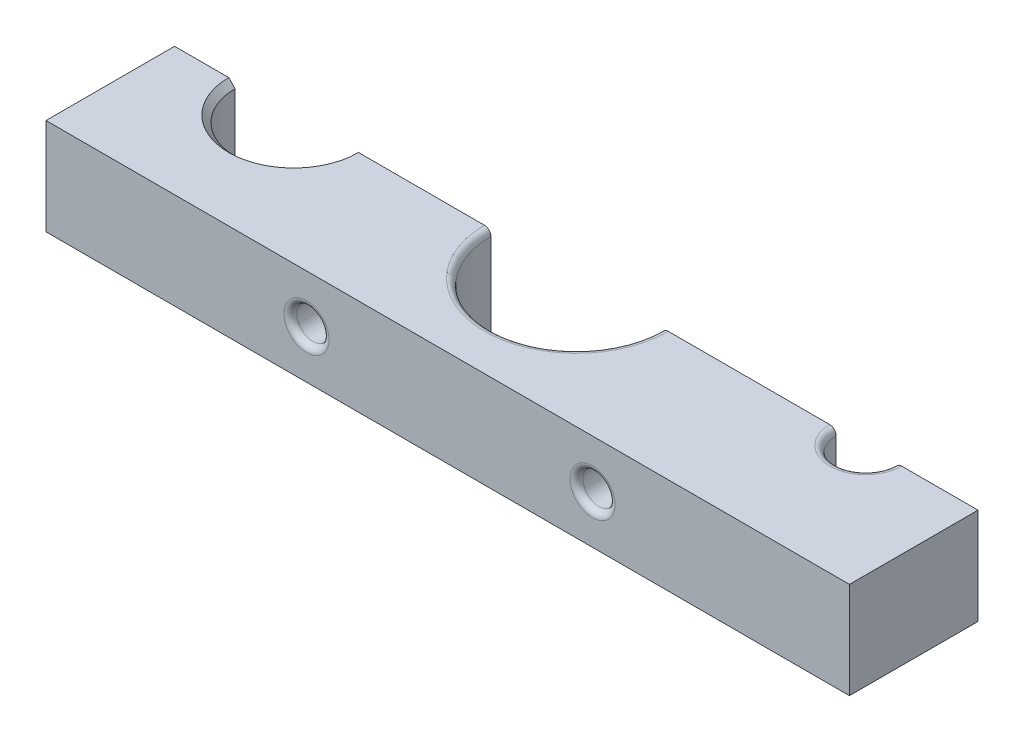
ISO-10303-21;
HEADER;
FILE_DESCRIPTION(('STEP AP214'),'2;1');
FILE_NAME('part.step','',(''),(''),'','','');
FILE_SCHEMA(('AUTOMOTIVE_DESIGN { 1 0 10303 214 1 1 1 1 }'));
ENDSEC;
DATA;
#1=APPLICATION_CONTEXT('core data for automotive mechanical design processes');
#2=APPLICATION_PROTOCOL_DEFINITION('international standard','automotive_design',2000,#1);
#3=PRODUCT_CONTEXT('',#1,'mechanical');
#4=PRODUCT('Part','Part','',(#3));
#5=PRODUCT_RELATED_PRODUCT_CATEGORY('part','',(#4));
#6=PRODUCT_DEFINITION_FORMATION('','',#4);
#7=PRODUCT_DEFINITION_CONTEXT('part definition',#1,'design');
#8=PRODUCT_DEFINITION('design','',#6,#7);
#9=PRODUCT_DEFINITION_SHAPE('','',#8);
#10=(LENGTH_UNIT() NAMED_UNIT(*) SI_UNIT(.MILLI.,.METRE.));
#11=(NAMED_UNIT(*) PLANE_ANGLE_UNIT() SI_UNIT($,.RADIAN.));
#12=(NAMED_UNIT(*) SI_UNIT($,.STERADIAN.) SOLID_ANGLE_UNIT());
#13=UNCERTAINTY_MEASURE_WITH_UNIT(LENGTH_MEASURE(1.E-05),#10,'distance_accuracy_value','');
#14=(GEOMETRIC_REPRESENTATION_CONTEXT(3) GLOBAL_UNCERTAINTY_ASSIGNED_CONTEXT((#13)) GLOBAL_UNIT_ASSIGNED_CONTEXT((#10,
#11,#12)) REPRESENTATION_CONTEXT('',''));
#15=CARTESIAN_POINT('',(0.,0.,0.));
#16=DIRECTION('',(0.,0.,1.));
#17=DIRECTION('',(1.,0.,0.));
#18=AXIS2_PLACEMENT_3D('',#15,#16,#17);
#19=CARTESIAN_POINT('',(0.,15.,0.));
#20=DIRECTION('',(1.,0.,0.));
#21=DIRECTION('',(0.,0.,-1.));
#22=AXIS2_PLACEMENT_3D('',#19,#20,#21);
#23=PLANE('',#22);
#24=DIRECTION('',(0.,0.,1.));
#25=VECTOR('',#24,1.);
#26=CARTESIAN_POINT('',(0.,15.,0.));
#27=LINE('',#26,#25);
#28=CARTESIAN_POINT('',(0.,15.,-20.));
#29=VERTEX_POINT('',#28);
#30=CARTESIAN_POINT('',(0.,15.,0.));
#31=VERTEX_POINT('',#30);
#32=EDGE_CURVE('E163',#29,#31,#27,.T.);
#33=ORIENTED_EDGE('',*,*,#32,.F.);
#34=DIRECTION('',(0.,1.,0.));
#35=VECTOR('',#34,1.);
#36=CARTESIAN_POINT('',(0.,0.,-20.));
#37=LINE('',#36,#35);
#38=CARTESIAN_POINT('',(0.,0.,-20.));
#39=VERTEX_POINT('',#38);
#40=EDGE_CURVE('E148',#39,#29,#37,.T.);
#41=ORIENTED_EDGE('',*,*,#40,.F.);
#42=DIRECTION('',(0.,0.,1.));
#43=VECTOR('',#42,1.);
#44=CARTESIAN_POINT('',(0.,0.,0.));
#45=LINE('',#44,#43);
#46=CARTESIAN_POINT('',(0.,0.,0.));
#47=VERTEX_POINT('',#46);
#48=EDGE_CURVE('E161',#39,#47,#45,.T.);
#49=ORIENTED_EDGE('',*,*,#48,.T.);
#50=DIRECTION('',(0.,-1.,0.));
#51=VECTOR('',#50,1.);
#52=CARTESIAN_POINT('',(0.,15.,0.));
#53=LINE('',#52,#51);
#54=EDGE_CURVE('E186',#31,#47,#53,.T.);
#55=ORIENTED_EDGE('',*,*,#54,.F.);
#56=EDGE_LOOP('',(#33,#41,#49,#55));
#57=FACE_BOUND('',#56,.T.);
#58=ADVANCED_FACE('F33',(#57),#23,.F.);
#59=CARTESIAN_POINT('',(0.,15.,0.));
#60=DIRECTION('',(0.,0.,-1.));
#61=DIRECTION('',(-1.,0.,0.));
#62=AXIS2_PLACEMENT_3D('',#59,#60,#61);
#63=PLANE('',#62);
#64=CARTESIAN_POINT('',(40.53,7.49999999999999,0.));
#65=DIRECTION('',(0.,0.,-1.));
#66=DIRECTION('',(-1.,0.,0.));
#67=AXIS2_PLACEMENT_3D('',#64,#65,#66);
#68=CIRCLE('',#67,3.5);
#69=CARTESIAN_POINT('',(37.03,7.49999999999999,0.));
#70=VERTEX_POINT('',#69);
#71=EDGE_CURVE('E11',#70,#70,#68,.T.);
#72=ORIENTED_EDGE('',*,*,#71,.T.);
#73=EDGE_LOOP('',(#72));
#74=FACE_BOUND('',#73,.T.);
#75=CARTESIAN_POINT('',(85.03,7.5,0.));
#76=DIRECTION('',(0.,0.,-1.));
#77=DIRECTION('',(-1.,0.,0.));
#78=AXIS2_PLACEMENT_3D('',#75,#76,#77);
#79=CIRCLE('',#78,3.5);
#80=CARTESIAN_POINT('',(81.53,7.5,0.));
#81=VERTEX_POINT('',#80);
#82=EDGE_CURVE('E42',#81,#81,#79,.T.);
#83=ORIENTED_EDGE('',*,*,#82,.T.);
#84=EDGE_LOOP('',(#83));
#85=FACE_BOUND('',#84,.T.);
#86=DIRECTION('',(1.,0.,0.));
#87=VECTOR('',#86,1.);
#88=CARTESIAN_POINT('',(0.,0.,0.));
#89=LINE('',#88,#87);
#90=CARTESIAN_POINT('',(125.,0.,0.));
#91=VERTEX_POINT('',#90);
#92=EDGE_CURVE('E168',#47,#91,#89,.T.);
#93=ORIENTED_EDGE('',*,*,#92,.T.);
#94=DIRECTION('',(0.,-1.,0.));
#95=VECTOR('',#94,1.);
#96=CARTESIAN_POINT('',(125.,15.,0.));
#97=LINE('',#96,#95);
#98=CARTESIAN_POINT('',(125.,15.,0.));
#99=VERTEX_POINT('',#98);
#100=EDGE_CURVE('E183',#99,#91,#97,.T.);
#101=ORIENTED_EDGE('',*,*,#100,.F.);
#102=DIRECTION('',(1.,0.,0.));
#103=VECTOR('',#102,1.);
#104=CARTESIAN_POINT('',(0.,15.,0.));
#105=LINE('',#104,#103);
#106=EDGE_CURVE('E498',#31,#99,#105,.T.);
#107=ORIENTED_EDGE('',*,*,#106,.F.);
#108=ORIENTED_EDGE('',*,*,#54,.T.);
#109=EDGE_LOOP('',(#93,#101,#107,#108));
#110=FACE_BOUND('',#109,.T.);
#111=ADVANCED_FACE('F232',(#74,#85,#110),#63,.F.);
#112=CARTESIAN_POINT('',(125.,15.,0.));
#113=DIRECTION('',(-1.,0.,0.));
#114=DIRECTION('',(0.,0.,1.));
#115=AXIS2_PLACEMENT_3D('',#112,#113,#114);
#116=PLANE('',#115);
#117=DIRECTION('',(0.,0.,-1.));
#118=VECTOR('',#117,1.);
#119=CARTESIAN_POINT('',(125.,0.,0.));
#120=LINE('',#119,#118);
#121=CARTESIAN_POINT('',(125.,0.,-20.));
#122=VERTEX_POINT('',#121);
#123=EDGE_CURVE('E172',#91,#122,#120,.T.);
#124=ORIENTED_EDGE('',*,*,#123,.T.);
#125=DIRECTION('',(0.,1.,0.));
#126=VECTOR('',#125,1.);
#127=CARTESIAN_POINT('',(125.,15.,-20.));
#128=LINE('',#127,#126);
#129=CARTESIAN_POINT('',(125.,15.,-20.));
#130=VERTEX_POINT('',#129);
#131=EDGE_CURVE('E170',#122,#130,#128,.T.);
#132=ORIENTED_EDGE('',*,*,#131,.T.);
#133=DIRECTION('',(0.,0.,-1.));
#134=VECTOR('',#133,1.);
#135=CARTESIAN_POINT('',(125.,15.,0.));
#136=LINE('',#135,#134);
#137=EDGE_CURVE('E178',#99,#130,#136,.T.);
#138=ORIENTED_EDGE('',*,*,#137,.F.);
#139=ORIENTED_EDGE('',*,*,#100,.T.);
#140=EDGE_LOOP('',(#124,#132,#138,#139));
#141=FACE_BOUND('',#140,.T.);
#142=ADVANCED_FACE('F263',(#141),#116,.F.);
#143=CARTESIAN_POINT('',(0.,15.,0.));
#144=DIRECTION('',(0.,-1.,0.));
#145=DIRECTION('',(0.,0.,-1.));
#146=AXIS2_PLACEMENT_3D('',#143,#144,#145);
#147=PLANE('',#146);
#148=ORIENTED_EDGE('',*,*,#137,.T.);
#149=DIRECTION('',(1.,0.,0.));
#150=VECTOR('',#149,1.);
#151=CARTESIAN_POINT('',(0.,15.,-20.));
#152=LINE('',#151,#150);
#153=CARTESIAN_POINT('',(113.126668527053,15.,-20.));
#154=VERTEX_POINT('',#153);
#155=EDGE_CURVE('E458',#154,#130,#152,.T.);
#156=ORIENTED_EDGE('',*,*,#155,.F.);
#157=CARTESIAN_POINT('',(107.526668527053,15.,-20.));
#158=DIRECTION('',(0.,-1.,0.));
#159=DIRECTION('',(0.,0.,-1.));
#160=AXIS2_PLACEMENT_3D('',#157,#158,#159);
#161=CIRCLE('',#160,5.60000000000001);
#162=CARTESIAN_POINT('',(101.926668527053,15.,-20.));
#163=VERTEX_POINT('',#162);
#164=EDGE_CURVE('E220',#154,#163,#161,.T.);
#165=ORIENTED_EDGE('',*,*,#164,.T.);
#166=CARTESIAN_POINT('',(76.8266685270529,15.,-20.));
#167=VERTEX_POINT('',#166);
#168=EDGE_CURVE('E503',#167,#163,#152,.T.);
#169=ORIENTED_EDGE('',*,*,#168,.F.);
#170=CARTESIAN_POINT('',(62.5266685270529,15.,-20.));
#171=DIRECTION('',(0.,-1.,0.));
#172=DIRECTION('',(0.,0.,-1.));
#173=AXIS2_PLACEMENT_3D('',#170,#171,#172);
#174=CIRCLE('',#173,14.3);
#175=CARTESIAN_POINT('',(48.2266685270529,15.,-20.));
#176=VERTEX_POINT('',#175);
#177=EDGE_CURVE('E217',#167,#176,#174,.T.);
#178=ORIENTED_EDGE('',*,*,#177,.T.);
#179=CARTESIAN_POINT('',(28.6266685270529,15.,-20.));
#180=VERTEX_POINT('',#179);
#181=EDGE_CURVE('E456',#180,#176,#152,.T.);
#182=ORIENTED_EDGE('',*,*,#181,.F.);
#183=CARTESIAN_POINT('',(18.5266685270529,15.,-20.));
#184=DIRECTION('',(0.,-1.,0.));
#185=DIRECTION('',(0.,0.,-1.));
#186=AXIS2_PLACEMENT_3D('',#183,#184,#185);
#187=CIRCLE('',#186,10.1);
#188=CARTESIAN_POINT('',(8.42666852705294,15.,-20.));
#189=VERTEX_POINT('',#188);
#190=EDGE_CURVE('E191',#180,#189,#187,.T.);
#191=ORIENTED_EDGE('',*,*,#190,.T.);
#192=EDGE_CURVE('E455',#29,#189,#152,.T.);
#193=ORIENTED_EDGE('',*,*,#192,.F.);
#194=ORIENTED_EDGE('',*,*,#32,.T.);
#195=ORIENTED_EDGE('',*,*,#106,.T.);
#196=EDGE_LOOP('',(#148,#156,#165,#169,#178,#182,#191,#193,#194,#195));
#197=FACE_BOUND('',#196,.T.);
#198=ADVANCED_FACE('F410',(#197),#147,.F.);
#199=CARTESIAN_POINT('',(0.,0.,0.));
#200=DIRECTION('',(0.,-1.,0.));
#201=DIRECTION('',(0.,0.,-1.));
#202=AXIS2_PLACEMENT_3D('',#199,#200,#201);
#203=PLANE('',#202);
#204=DIRECTION('',(1.,0.,0.));
#205=VECTOR('',#204,1.);
#206=CARTESIAN_POINT('',(0.,0.,-20.));
#207=LINE('',#206,#205);
#208=CARTESIAN_POINT('',(113.126668527053,0.,-20.));
#209=VERTEX_POINT('',#208);
#210=EDGE_CURVE('E157',#209,#122,#207,.T.);
#211=ORIENTED_EDGE('',*,*,#210,.T.);
#212=ORIENTED_EDGE('',*,*,#123,.F.);
#213=ORIENTED_EDGE('',*,*,#92,.F.);
#214=ORIENTED_EDGE('',*,*,#48,.F.);
#215=CARTESIAN_POINT('',(8.42666852705294,0.,-20.));
#216=VERTEX_POINT('',#215);
#217=EDGE_CURVE('E145',#39,#216,#207,.T.);
#218=ORIENTED_EDGE('',*,*,#217,.T.);
#219=CARTESIAN_POINT('',(18.5266685270529,0.,-20.));
#220=DIRECTION('',(0.,-1.,0.));
#221=DIRECTION('',(0.,0.,-1.));
#222=AXIS2_PLACEMENT_3D('',#219,#220,#221);
#223=CIRCLE('',#222,10.1);
#224=CARTESIAN_POINT('',(28.6266685270529,0.,-20.));
#225=VERTEX_POINT('',#224);
#226=EDGE_CURVE('E194',#216,#225,#223,.F.);
#227=ORIENTED_EDGE('',*,*,#226,.T.);
#228=CARTESIAN_POINT('',(48.2266685270529,0.,-20.));
#229=VERTEX_POINT('',#228);
#230=EDGE_CURVE('E155',#225,#229,#207,.T.);
#231=ORIENTED_EDGE('',*,*,#230,.T.);
#232=CARTESIAN_POINT('',(62.5266685270529,0.,-20.));
#233=DIRECTION('',(0.,-1.,0.));
#234=DIRECTION('',(0.,0.,-1.));
#235=AXIS2_PLACEMENT_3D('',#232,#233,#234);
#236=CIRCLE('',#235,14.3);
#237=CARTESIAN_POINT('',(76.8266685270529,0.,-20.));
#238=VERTEX_POINT('',#237);
#239=EDGE_CURVE('E202',#229,#238,#236,.F.);
#240=ORIENTED_EDGE('',*,*,#239,.T.);
#241=CARTESIAN_POINT('',(101.926668527053,0.,-20.));
#242=VERTEX_POINT('',#241);
#243=EDGE_CURVE('E454',#238,#242,#207,.T.);
#244=ORIENTED_EDGE('',*,*,#243,.T.);
#245=CARTESIAN_POINT('',(107.526668527053,0.,-20.));
#246=DIRECTION('',(0.,-1.,0.));
#247=DIRECTION('',(0.,0.,-1.));
#248=AXIS2_PLACEMENT_3D('',#245,#246,#247);
#249=CIRCLE('',#248,5.60000000000001);
#250=EDGE_CURVE('E199',#242,#209,#249,.F.);
#251=ORIENTED_EDGE('',*,*,#250,.T.);
#252=EDGE_LOOP('',(#211,#212,#213,#214,#218,#227,#231,#240,#244,#251));
#253=FACE_BOUND('',#252,.T.);
#254=ADVANCED_FACE('F166',(#253),#203,.T.);
#255=CARTESIAN_POINT('',(62.5266685270529,0.,-20.));
#256=DIRECTION('',(0.,1.,0.));
#257=DIRECTION('',(0.,0.,1.));
#258=AXIS2_PLACEMENT_3D('',#255,#256,#257);
#259=CYLINDRICAL_SURFACE('',#258,13.3);
#260=CARTESIAN_POINT('',(62.5266685270529,14.,-20.));
#261=DIRECTION('',(0.,-1.,0.));
#262=DIRECTION('',(0.,0.,-1.));
#263=AXIS2_PLACEMENT_3D('',#260,#261,#262);
#264=CIRCLE('',#263,13.3);
#265=CARTESIAN_POINT('',(49.2266685270529,14.,-20.));
#266=VERTEX_POINT('',#265);
#267=CARTESIAN_POINT('',(75.8266685270529,14.,-20.));
#268=VERTEX_POINT('',#267);
#269=EDGE_CURVE('E205',#266,#268,#264,.F.);
#270=ORIENTED_EDGE('',*,*,#269,.T.);
#271=DIRECTION('',(0.,1.,0.));
#272=VECTOR('',#271,1.);
#273=CARTESIAN_POINT('',(75.8266685270529,0.,-20.));
#274=LINE('',#273,#272);
#275=CARTESIAN_POINT('',(75.8266685270529,1.,-20.));
#276=VERTEX_POINT('',#275);
#277=EDGE_CURVE('E464',#268,#276,#274,.F.);
#278=ORIENTED_EDGE('',*,*,#277,.T.);
#279=CARTESIAN_POINT('',(62.5266685270529,1.,-20.));
#280=DIRECTION('',(0.,-1.,0.));
#281=DIRECTION('',(0.,0.,-1.));
#282=AXIS2_PLACEMENT_3D('',#279,#280,#281);
#283=CIRCLE('',#282,13.3);
#284=CARTESIAN_POINT('',(49.2266685270529,1.,-20.));
#285=VERTEX_POINT('',#284);
#286=EDGE_CURVE('E208',#276,#285,#283,.T.);
#287=ORIENTED_EDGE('',*,*,#286,.T.);
#288=DIRECTION('',(0.,1.,0.));
#289=VECTOR('',#288,1.);
#290=CARTESIAN_POINT('',(49.2266685270529,0.,-20.));
#291=LINE('',#290,#289);
#292=EDGE_CURVE('E471',#285,#266,#291,.T.);
#293=ORIENTED_EDGE('',*,*,#292,.T.);
#294=EDGE_LOOP('',(#270,#278,#287,#293));
#295=FACE_BOUND('',#294,.T.);
#296=ADVANCED_FACE('F393',(#295),#259,.F.);
#297=CARTESIAN_POINT('',(107.526668527053,0.,-20.));
#298=DIRECTION('',(0.,1.,0.));
#299=DIRECTION('',(0.,0.,1.));
#300=AXIS2_PLACEMENT_3D('',#297,#298,#299);
#301=CYLINDRICAL_SURFACE('',#300,4.60000000000001);
#302=CARTESIAN_POINT('',(107.526668527053,14.,-20.));
#303=DIRECTION('',(0.,-1.,0.));
#304=DIRECTION('',(0.,0.,-1.));
#305=AXIS2_PLACEMENT_3D('',#302,#303,#304);
#306=CIRCLE('',#305,4.60000000000001);
#307=CARTESIAN_POINT('',(102.926668527053,14.,-20.));
#308=VERTEX_POINT('',#307);
#309=CARTESIAN_POINT('',(112.126668527053,14.,-20.));
#310=VERTEX_POINT('',#309);
#311=EDGE_CURVE('E211',#308,#310,#306,.F.);
#312=ORIENTED_EDGE('',*,*,#311,.T.);
#313=DIRECTION('',(0.,1.,0.));
#314=VECTOR('',#313,1.);
#315=CARTESIAN_POINT('',(112.126668527053,0.,-20.));
#316=LINE('',#315,#314);
#317=CARTESIAN_POINT('',(112.126668527053,1.,-20.));
#318=VERTEX_POINT('',#317);
#319=EDGE_CURVE('E57',#310,#318,#316,.F.);
#320=ORIENTED_EDGE('',*,*,#319,.T.);
#321=CARTESIAN_POINT('',(107.526668527053,1.,-20.));
#322=DIRECTION('',(0.,-1.,0.));
#323=DIRECTION('',(0.,0.,-1.));
#324=AXIS2_PLACEMENT_3D('',#321,#322,#323);
#325=CIRCLE('',#324,4.60000000000001);
#326=CARTESIAN_POINT('',(102.926668527053,1.,-20.));
#327=VERTEX_POINT('',#326);
#328=EDGE_CURVE('E214',#318,#327,#325,.T.);
#329=ORIENTED_EDGE('',*,*,#328,.T.);
#330=DIRECTION('',(0.,1.,0.));
#331=VECTOR('',#330,1.);
#332=CARTESIAN_POINT('',(102.926668527053,0.,-20.));
#333=LINE('',#332,#331);
#334=EDGE_CURVE('E483',#327,#308,#333,.T.);
#335=ORIENTED_EDGE('',*,*,#334,.T.);
#336=EDGE_LOOP('',(#312,#320,#329,#335));
#337=FACE_BOUND('',#336,.T.);
#338=ADVANCED_FACE('F385',(#337),#301,.F.);
#339=CARTESIAN_POINT('',(18.5266685270529,0.,-20.));
#340=DIRECTION('',(0.,1.,0.));
#341=DIRECTION('',(0.,0.,1.));
#342=AXIS2_PLACEMENT_3D('',#339,#340,#341);
#343=CYLINDRICAL_SURFACE('',#342,9.1);
#344=CARTESIAN_POINT('',(18.5266685270529,14.,-20.));
#345=DIRECTION('',(0.,-1.,0.));
#346=DIRECTION('',(0.,0.,-1.));
#347=AXIS2_PLACEMENT_3D('',#344,#345,#346);
#348=CIRCLE('',#347,9.1);
#349=CARTESIAN_POINT('',(9.42666852705293,14.,-20.));
#350=VERTEX_POINT('',#349);
#351=CARTESIAN_POINT('',(27.6266685270529,14.,-20.));
#352=VERTEX_POINT('',#351);
#353=EDGE_CURVE('E188',#350,#352,#348,.F.);
#354=ORIENTED_EDGE('',*,*,#353,.T.);
#355=DIRECTION('',(0.,1.,0.));
#356=VECTOR('',#355,1.);
#357=CARTESIAN_POINT('',(27.6266685270529,0.,-20.));
#358=LINE('',#357,#356);
#359=CARTESIAN_POINT('',(27.6266685270529,0.999999999999994,-20.));
#360=VERTEX_POINT('',#359);
#361=EDGE_CURVE('E490',#352,#360,#358,.F.);
#362=ORIENTED_EDGE('',*,*,#361,.T.);
#363=CARTESIAN_POINT('',(18.5266685270529,0.999999999999994,-20.));
#364=DIRECTION('',(0.,-1.,0.));
#365=DIRECTION('',(0.,0.,-1.));
#366=AXIS2_PLACEMENT_3D('',#363,#364,#365);
#367=CIRCLE('',#366,9.1);
#368=CARTESIAN_POINT('',(9.42666852705293,0.999999999999994,-20.));
#369=VERTEX_POINT('',#368);
#370=EDGE_CURVE('E196',#360,#369,#367,.T.);
#371=ORIENTED_EDGE('',*,*,#370,.T.);
#372=DIRECTION('',(0.,1.,0.));
#373=VECTOR('',#372,1.);
#374=CARTESIAN_POINT('',(9.42666852705293,0.,-20.));
#375=LINE('',#374,#373);
#376=EDGE_CURVE('E49',#369,#350,#375,.T.);
#377=ORIENTED_EDGE('',*,*,#376,.T.);
#378=EDGE_LOOP('',(#354,#362,#371,#377));
#379=FACE_BOUND('',#378,.T.);
#380=ADVANCED_FACE('F272',(#379),#343,.F.);
#381=CARTESIAN_POINT('',(18.5266685270529,14.,-20.));
#382=DIRECTION('',(0.,1.,0.));
#383=DIRECTION('',(0.,0.,1.));
#384=AXIS2_PLACEMENT_3D('',#381,#382,#383);
#385=CONICAL_SURFACE('',#384,9.1,0.785398163397447);
#386=DIRECTION('',(0.707106781186546,0.707106781186549,0.));
#387=VECTOR('',#386,1.);
#388=CARTESIAN_POINT('',(18.5266685270529,4.89999999999998,-20.));
#389=LINE('',#388,#387);
#390=EDGE_CURVE('E493',#352,#180,#389,.T.);
#391=ORIENTED_EDGE('',*,*,#390,.F.);
#392=ORIENTED_EDGE('',*,*,#353,.F.);
#393=DIRECTION('',(0.707106781186546,-0.707106781186549,0.));
#394=VECTOR('',#393,1.);
#395=CARTESIAN_POINT('',(18.5266685270529,4.89999999999998,-20.));
#396=LINE('',#395,#394);
#397=EDGE_CURVE('E175',#189,#350,#396,.T.);
#398=ORIENTED_EDGE('',*,*,#397,.F.);
#399=ORIENTED_EDGE('',*,*,#190,.F.);
#400=EDGE_LOOP('',(#391,#392,#398,#399));
#401=FACE_BOUND('',#400,.T.);
#402=ADVANCED_FACE('F268',(#401),#385,.F.);
#403=CARTESIAN_POINT('',(18.5266685270529,0.,-20.));
#404=DIRECTION('',(0.,-1.,0.));
#405=DIRECTION('',(0.,0.,-1.));
#406=AXIS2_PLACEMENT_3D('',#403,#404,#405);
#407=CONICAL_SURFACE('',#406,10.1,0.785398163397443);
#408=DIRECTION('',(-0.707106781186544,-0.707106781186551,0.));
#409=VECTOR('',#408,1.);
#410=CARTESIAN_POINT('',(18.5266685270529,10.1000000000001,-20.));
#411=LINE('',#410,#409);
#412=EDGE_CURVE('E150',#369,#216,#411,.T.);
#413=ORIENTED_EDGE('',*,*,#412,.F.);
#414=ORIENTED_EDGE('',*,*,#370,.F.);
#415=DIRECTION('',(-0.707106781186544,0.707106781186551,0.));
#416=VECTOR('',#415,1.);
#417=CARTESIAN_POINT('',(18.5266685270529,10.1000000000001,-20.));
#418=LINE('',#417,#416);
#419=EDGE_CURVE('E488',#225,#360,#418,.T.);
#420=ORIENTED_EDGE('',*,*,#419,.F.);
#421=ORIENTED_EDGE('',*,*,#226,.F.);
#422=EDGE_LOOP('',(#413,#414,#420,#421));
#423=FACE_BOUND('',#422,.T.);
#424=ADVANCED_FACE('F271',(#423),#407,.F.);
#425=CARTESIAN_POINT('',(62.5266685270529,1.,-20.));
#426=DIRECTION('',(0.,-1.,0.));
#427=DIRECTION('',(0.,0.,-1.));
#428=AXIS2_PLACEMENT_3D('',#425,#426,#427);
#429=TOROIDAL_SURFACE('',#428,14.3,1.);
#430=CARTESIAN_POINT('',(48.2266685270529,1.,-20.));
#431=DIRECTION('',(0.,0.,1.));
#432=DIRECTION('',(1.,0.,0.));
#433=AXIS2_PLACEMENT_3D('',#430,#431,#432);
#434=CIRCLE('',#433,1.);
#435=EDGE_CURVE('E474',#285,#229,#434,.F.);
#436=ORIENTED_EDGE('',*,*,#435,.F.);
#437=ORIENTED_EDGE('',*,*,#286,.F.);
#438=CARTESIAN_POINT('',(76.8266685270529,1.,-20.));
#439=DIRECTION('',(0.,0.,1.));
#440=DIRECTION('',(1.,0.,0.));
#441=AXIS2_PLACEMENT_3D('',#438,#439,#440);
#442=CIRCLE('',#441,1.);
#443=EDGE_CURVE('E467',#238,#276,#442,.F.);
#444=ORIENTED_EDGE('',*,*,#443,.F.);
#445=ORIENTED_EDGE('',*,*,#239,.F.);
#446=EDGE_LOOP('',(#436,#437,#444,#445));
#447=FACE_BOUND('',#446,.T.);
#448=ADVANCED_FACE('F276',(#447),#429,.T.);
#449=CARTESIAN_POINT('',(107.526668527053,1.,-20.));
#450=DIRECTION('',(0.,-1.,0.));
#451=DIRECTION('',(0.,0.,-1.));
#452=AXIS2_PLACEMENT_3D('',#449,#450,#451);
#453=TOROIDAL_SURFACE('',#452,5.60000000000001,1.);
#454=CARTESIAN_POINT('',(101.926668527053,1.,-20.));
#455=DIRECTION('',(0.,0.,1.));
#456=DIRECTION('',(1.,0.,0.));
#457=AXIS2_PLACEMENT_3D('',#454,#455,#456);
#458=CIRCLE('',#457,1.);
#459=EDGE_CURVE('E486',#327,#242,#458,.F.);
#460=ORIENTED_EDGE('',*,*,#459,.F.);
#461=ORIENTED_EDGE('',*,*,#328,.F.);
#462=CARTESIAN_POINT('',(113.126668527053,1.,-20.));
#463=DIRECTION('',(0.,0.,1.));
#464=DIRECTION('',(1.,0.,0.));
#465=AXIS2_PLACEMENT_3D('',#462,#463,#464);
#466=CIRCLE('',#465,1.);
#467=EDGE_CURVE('E479',#209,#318,#466,.F.);
#468=ORIENTED_EDGE('',*,*,#467,.F.);
#469=ORIENTED_EDGE('',*,*,#250,.F.);
#470=EDGE_LOOP('',(#460,#461,#468,#469));
#471=FACE_BOUND('',#470,.T.);
#472=ADVANCED_FACE('F280',(#471),#453,.T.);
#473=CARTESIAN_POINT('',(107.526668527053,14.,-20.));
#474=DIRECTION('',(0.,-1.,0.));
#475=DIRECTION('',(0.,0.,-1.));
#476=AXIS2_PLACEMENT_3D('',#473,#474,#475);
#477=TOROIDAL_SURFACE('',#476,5.60000000000001,1.);
#478=CARTESIAN_POINT('',(101.926668527053,14.,-20.));
#479=DIRECTION('',(0.,0.,1.));
#480=DIRECTION('',(1.,0.,0.));
#481=AXIS2_PLACEMENT_3D('',#478,#479,#480);
#482=CIRCLE('',#481,1.);
#483=EDGE_CURVE('E481',#163,#308,#482,.F.);
#484=ORIENTED_EDGE('',*,*,#483,.F.);
#485=ORIENTED_EDGE('',*,*,#164,.F.);
#486=CARTESIAN_POINT('',(113.126668527053,14.,-20.));
#487=DIRECTION('',(0.,0.,1.));
#488=DIRECTION('',(1.,0.,0.));
#489=AXIS2_PLACEMENT_3D('',#486,#487,#488);
#490=CIRCLE('',#489,1.);
#491=EDGE_CURVE('E476',#310,#154,#490,.F.);
#492=ORIENTED_EDGE('',*,*,#491,.F.);
#493=ORIENTED_EDGE('',*,*,#311,.F.);
#494=EDGE_LOOP('',(#484,#485,#492,#493));
#495=FACE_BOUND('',#494,.T.);
#496=ADVANCED_FACE('F253',(#495),#477,.T.);
#497=CARTESIAN_POINT('',(62.5266685270529,14.,-20.));
#498=DIRECTION('',(0.,-1.,0.));
#499=DIRECTION('',(0.,0.,-1.));
#500=AXIS2_PLACEMENT_3D('',#497,#498,#499);
#501=TOROIDAL_SURFACE('',#500,14.3,1.);
#502=CARTESIAN_POINT('',(48.2266685270529,14.,-20.));
#503=DIRECTION('',(0.,0.,1.));
#504=DIRECTION('',(1.,0.,0.));
#505=AXIS2_PLACEMENT_3D('',#502,#503,#504);
#506=CIRCLE('',#505,1.);
#507=EDGE_CURVE('E469',#176,#266,#506,.F.);
#508=ORIENTED_EDGE('',*,*,#507,.F.);
#509=ORIENTED_EDGE('',*,*,#177,.F.);
#510=CARTESIAN_POINT('',(76.8266685270529,14.,-20.));
#511=DIRECTION('',(0.,0.,1.));
#512=DIRECTION('',(1.,0.,0.));
#513=AXIS2_PLACEMENT_3D('',#510,#511,#512);
#514=CIRCLE('',#513,1.);
#515=EDGE_CURVE('E462',#268,#167,#514,.F.);
#516=ORIENTED_EDGE('',*,*,#515,.F.);
#517=ORIENTED_EDGE('',*,*,#269,.F.);
#518=EDGE_LOOP('',(#508,#509,#516,#517));
#519=FACE_BOUND('',#518,.T.);
#520=ADVANCED_FACE('F244',(#519),#501,.T.);
#521=CARTESIAN_POINT('',(85.03,7.5,-40.));
#522=DIRECTION('',(0.,0.,1.));
#523=DIRECTION('',(1.,0.,0.));
#524=AXIS2_PLACEMENT_3D('',#521,#522,#523);
#525=CYLINDRICAL_SURFACE('',#524,2.5);
#526=CARTESIAN_POINT('',(85.03,7.5,-20.));
#527=DIRECTION('',(0.,0.,1.));
#528=DIRECTION('',(1.,0.,0.));
#529=AXIS2_PLACEMENT_3D('',#526,#527,#528);
#530=CIRCLE('',#529,2.5);
#531=CARTESIAN_POINT('',(87.53,7.5,-20.));
#532=VERTEX_POINT('',#531);
#533=EDGE_CURVE('E460',#532,#532,#530,.F.);
#534=ORIENTED_EDGE('',*,*,#533,.T.);
#535=EDGE_LOOP('',(#534));
#536=FACE_BOUND('',#535,.T.);
#537=CARTESIAN_POINT('',(85.03,7.5,-1.));
#538=DIRECTION('',(0.,0.,-1.));
#539=DIRECTION('',(-1.,0.,0.));
#540=AXIS2_PLACEMENT_3D('',#537,#538,#539);
#541=CIRCLE('',#540,2.5);
#542=CARTESIAN_POINT('',(82.53,7.5,-1.));
#543=VERTEX_POINT('',#542);
#544=EDGE_CURVE('E223',#543,#543,#541,.F.);
#545=ORIENTED_EDGE('',*,*,#544,.T.);
#546=EDGE_LOOP('',(#545));
#547=FACE_BOUND('',#546,.T.);
#548=ADVANCED_FACE('F241',(#536,#547),#525,.F.);
#549=CARTESIAN_POINT('',(40.53,7.49999999999999,-40.));
#550=DIRECTION('',(0.,0.,1.));
#551=DIRECTION('',(1.,0.,0.));
#552=AXIS2_PLACEMENT_3D('',#549,#550,#551);
#553=CYLINDRICAL_SURFACE('',#552,2.5);
#554=CARTESIAN_POINT('',(40.53,7.49999999999999,-20.));
#555=DIRECTION('',(0.,0.,1.));
#556=DIRECTION('',(1.,0.,0.));
#557=AXIS2_PLACEMENT_3D('',#554,#555,#556);
#558=CIRCLE('',#557,2.5);
#559=CARTESIAN_POINT('',(43.03,7.49999999999999,-20.));
#560=VERTEX_POINT('',#559);
#561=EDGE_CURVE('E37',#560,#560,#558,.F.);
#562=ORIENTED_EDGE('',*,*,#561,.T.);
#563=EDGE_LOOP('',(#562));
#564=FACE_BOUND('',#563,.T.);
#565=CARTESIAN_POINT('',(40.53,7.49999999999999,-1.));
#566=DIRECTION('',(0.,0.,-1.));
#567=DIRECTION('',(-1.,0.,0.));
#568=AXIS2_PLACEMENT_3D('',#565,#566,#567);
#569=CIRCLE('',#568,2.5);
#570=CARTESIAN_POINT('',(38.03,7.49999999999999,-1.));
#571=VERTEX_POINT('',#570);
#572=EDGE_CURVE('E226',#571,#571,#569,.F.);
#573=ORIENTED_EDGE('',*,*,#572,.T.);
#574=EDGE_LOOP('',(#573));
#575=FACE_BOUND('',#574,.T.);
#576=ADVANCED_FACE('F243',(#564,#575),#553,.F.);
#577=CARTESIAN_POINT('',(40.53,7.49999999999999,-1.));
#578=DIRECTION('',(0.,0.,-1.));
#579=DIRECTION('',(-1.,0.,0.));
#580=AXIS2_PLACEMENT_3D('',#577,#578,#579);
#581=TOROIDAL_SURFACE('',#580,3.5,1.);
#582=ORIENTED_EDGE('',*,*,#71,.F.);
#583=EDGE_LOOP('',(#582));
#584=FACE_BOUND('',#583,.T.);
#585=ORIENTED_EDGE('',*,*,#572,.F.);
#586=EDGE_LOOP('',(#585));
#587=FACE_BOUND('',#586,.T.);
#588=ADVANCED_FACE('F238',(#584,#587),#581,.T.);
#589=CARTESIAN_POINT('',(85.03,7.5,-1.));
#590=DIRECTION('',(0.,0.,-1.));
#591=DIRECTION('',(-1.,0.,0.));
#592=AXIS2_PLACEMENT_3D('',#589,#590,#591);
#593=TOROIDAL_SURFACE('',#592,3.5,1.);
#594=ORIENTED_EDGE('',*,*,#82,.F.);
#595=EDGE_LOOP('',(#594));
#596=FACE_BOUND('',#595,.T.);
#597=ORIENTED_EDGE('',*,*,#544,.F.);
#598=EDGE_LOOP('',(#597));
#599=FACE_BOUND('',#598,.T.);
#600=ADVANCED_FACE('F35',(#596,#599),#593,.T.);
#601=CARTESIAN_POINT('',(0.,0.,-20.));
#602=DIRECTION('',(0.,0.,1.));
#603=DIRECTION('',(1.,0.,0.));
#604=AXIS2_PLACEMENT_3D('',#601,#602,#603);
#605=PLANE('',#604);
#606=ORIENTED_EDGE('',*,*,#390,.T.);
#607=ORIENTED_EDGE('',*,*,#181,.T.);
#608=ORIENTED_EDGE('',*,*,#507,.T.);
#609=ORIENTED_EDGE('',*,*,#292,.F.);
#610=ORIENTED_EDGE('',*,*,#435,.T.);
#611=ORIENTED_EDGE('',*,*,#230,.F.);
#612=ORIENTED_EDGE('',*,*,#419,.T.);
#613=ORIENTED_EDGE('',*,*,#361,.F.);
#614=EDGE_LOOP('',(#606,#607,#608,#609,#610,#611,#612,#613));
#615=FACE_BOUND('',#614,.T.);
#616=ORIENTED_EDGE('',*,*,#561,.F.);
#617=EDGE_LOOP('',(#616));
#618=FACE_BOUND('',#617,.T.);
#619=ADVANCED_FACE('F237',(#615,#618),#605,.F.);
#620=ORIENTED_EDGE('',*,*,#459,.T.);
#621=ORIENTED_EDGE('',*,*,#243,.F.);
#622=ORIENTED_EDGE('',*,*,#443,.T.);
#623=ORIENTED_EDGE('',*,*,#277,.F.);
#624=ORIENTED_EDGE('',*,*,#515,.T.);
#625=ORIENTED_EDGE('',*,*,#168,.T.);
#626=ORIENTED_EDGE('',*,*,#483,.T.);
#627=ORIENTED_EDGE('',*,*,#334,.F.);
#628=EDGE_LOOP('',(#620,#621,#622,#623,#624,#625,#626,#627));
#629=FACE_BOUND('',#628,.T.);
#630=ORIENTED_EDGE('',*,*,#533,.F.);
#631=EDGE_LOOP('',(#630));
#632=FACE_BOUND('',#631,.T.);
#633=ADVANCED_FACE('F308',(#629,#632),#605,.F.);
#634=ORIENTED_EDGE('',*,*,#210,.F.);
#635=ORIENTED_EDGE('',*,*,#467,.T.);
#636=ORIENTED_EDGE('',*,*,#319,.F.);
#637=ORIENTED_EDGE('',*,*,#491,.T.);
#638=ORIENTED_EDGE('',*,*,#155,.T.);
#639=ORIENTED_EDGE('',*,*,#131,.F.);
#640=EDGE_LOOP('',(#634,#635,#636,#637,#638,#639));
#641=FACE_BOUND('',#640,.T.);
#642=ADVANCED_FACE('F311',(#641),#605,.F.);
#643=ORIENTED_EDGE('',*,*,#397,.T.);
#644=ORIENTED_EDGE('',*,*,#376,.F.);
#645=ORIENTED_EDGE('',*,*,#412,.T.);
#646=ORIENTED_EDGE('',*,*,#217,.F.);
#647=ORIENTED_EDGE('',*,*,#40,.T.);
#648=ORIENTED_EDGE('',*,*,#192,.T.);
#649=EDGE_LOOP('',(#643,#644,#645,#646,#647,#648));
#650=FACE_BOUND('',#649,.T.);
#651=ADVANCED_FACE('F147',(#650),#605,.F.);
#652=CLOSED_SHELL('',(#58,#111,#142,#198,#254,#296,#338,#380,#402,#424,#448,#472,#496,#520,#548,
#576,#588,#600,#619,#633,#642,#651));
#653=MANIFOLD_SOLID_BREP('B2',#652);
#654=ADVANCED_BREP_SHAPE_REPRESENTATION('',(#18,#653),#14);
#655=SHAPE_DEFINITION_REPRESENTATION(#9,#654);
ENDSEC;
END-ISO-10303-21;
